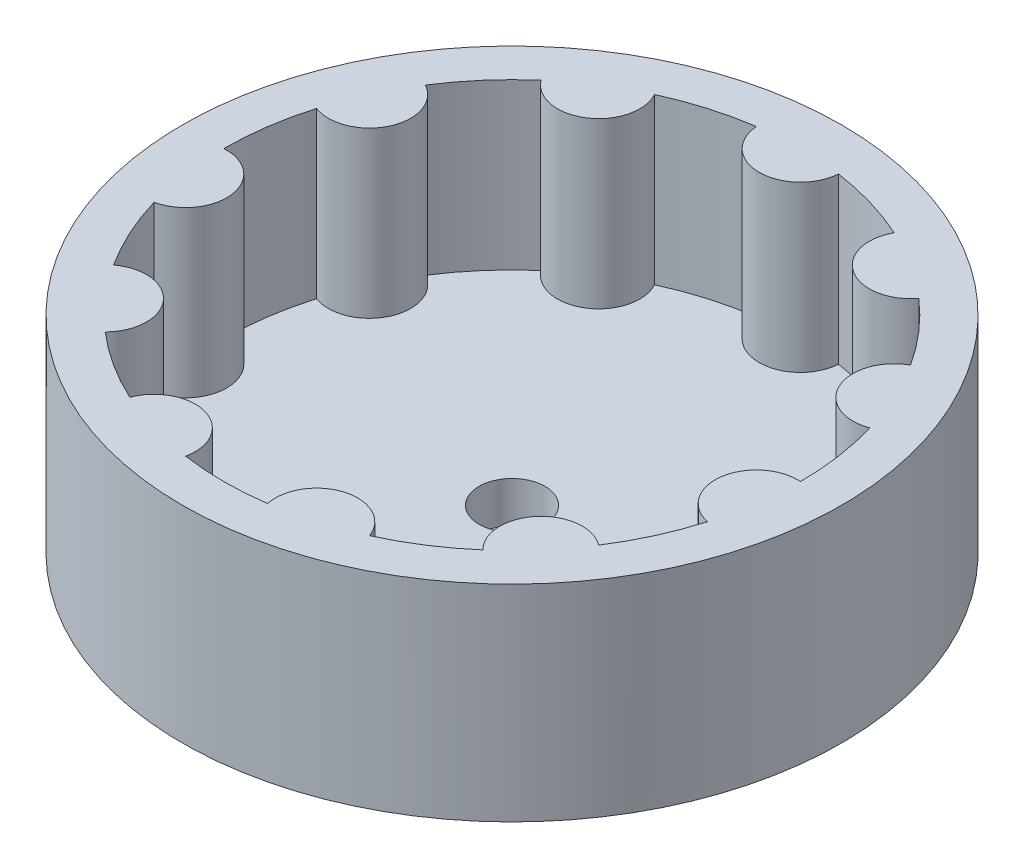
ISO-10303-21;
HEADER;
FILE_DESCRIPTION(('STEP AP214'),'2;1');
FILE_NAME('part.step','',(''),(''),'','','');
FILE_SCHEMA(('AUTOMOTIVE_DESIGN { 1 0 10303 214 1 1 1 1 }'));
ENDSEC;
DATA;
#1=APPLICATION_CONTEXT('core data for automotive mechanical design processes');
#2=APPLICATION_PROTOCOL_DEFINITION('international standard','automotive_design',2000,#1);
#3=PRODUCT_CONTEXT('',#1,'mechanical');
#4=PRODUCT('Part','Part','',(#3));
#5=PRODUCT_RELATED_PRODUCT_CATEGORY('part','',(#4));
#6=PRODUCT_DEFINITION_FORMATION('','',#4);
#7=PRODUCT_DEFINITION_CONTEXT('part definition',#1,'design');
#8=PRODUCT_DEFINITION('design','',#6,#7);
#9=PRODUCT_DEFINITION_SHAPE('','',#8);
#10=(LENGTH_UNIT() NAMED_UNIT(*) SI_UNIT(.MILLI.,.METRE.));
#11=(NAMED_UNIT(*) PLANE_ANGLE_UNIT() SI_UNIT($,.RADIAN.));
#12=(NAMED_UNIT(*) SI_UNIT($,.STERADIAN.) SOLID_ANGLE_UNIT());
#13=UNCERTAINTY_MEASURE_WITH_UNIT(LENGTH_MEASURE(1.E-05),#10,'distance_accuracy_value','');
#14=(GEOMETRIC_REPRESENTATION_CONTEXT(3) GLOBAL_UNCERTAINTY_ASSIGNED_CONTEXT((#13)) GLOBAL_UNIT_ASSIGNED_CONTEXT((#10,
#11,#12)) REPRESENTATION_CONTEXT('',''));
#15=CARTESIAN_POINT('',(0.,0.,0.));
#16=DIRECTION('',(0.,0.,1.));
#17=DIRECTION('',(1.,0.,0.));
#18=AXIS2_PLACEMENT_3D('',#15,#16,#17);
#19=CARTESIAN_POINT('',(0.,0.,0.));
#20=DIRECTION('',(0.,1.,0.));
#21=DIRECTION('',(0.,0.,1.));
#22=AXIS2_PLACEMENT_3D('',#19,#20,#21);
#23=PLANE('',#22);
#24=CARTESIAN_POINT('',(0.,0.,0.));
#25=DIRECTION('',(0.,1.,0.));
#26=DIRECTION('',(0.,0.,1.));
#27=AXIS2_PLACEMENT_3D('',#24,#25,#26);
#28=CIRCLE('',#27,4.);
#29=CARTESIAN_POINT('',(0.,0.,4.));
#30=VERTEX_POINT('',#29);
#31=EDGE_CURVE('E261',#30,#30,#28,.T.);
#32=ORIENTED_EDGE('',*,*,#31,.F.);
#33=EDGE_LOOP('',(#32));
#34=FACE_BOUND('',#33,.T.);
#35=CARTESIAN_POINT('',(0.,0.,0.));
#36=DIRECTION('',(0.,1.,0.));
#37=DIRECTION('',(0.,0.,1.));
#38=AXIS2_PLACEMENT_3D('',#35,#36,#37);
#39=CIRCLE('',#38,35.0000000000015);
#40=CARTESIAN_POINT('',(-22.9153843672518,0.,26.4553427364156));
#41=VERTEX_POINT('',#40);
#42=CARTESIAN_POINT('',(-14.5452315062388,0.,31.8345133531208));
#43=VERTEX_POINT('',#42);
#44=EDGE_CURVE('E216',#41,#43,#39,.T.);
#45=ORIENTED_EDGE('',*,*,#44,.T.);
#46=CARTESIAN_POINT('',(-9.86063948944448,0.,33.5822540765082));
#47=DIRECTION('',(0.,1.,0.));
#48=DIRECTION('',(0.,0.,1.));
#49=AXIS2_PLACEMENT_3D('',#46,#47,#48);
#50=CIRCLE('',#49,5.);
#51=CARTESIAN_POINT('',(-4.97480993205055,0.,34.6446426758897));
#52=VERTEX_POINT('',#51);
#53=EDGE_CURVE('E214',#52,#43,#50,.T.);
#54=ORIENTED_EDGE('',*,*,#53,.F.);
#55=CARTESIAN_POINT('',(4.97480993206165,0.,34.6446426758881));
#56=VERTEX_POINT('',#55);
#57=EDGE_CURVE('E198',#52,#56,#39,.T.);
#58=ORIENTED_EDGE('',*,*,#57,.T.);
#59=CARTESIAN_POINT('',(9.86063948945559,0.,33.5822540765066));
#60=DIRECTION('',(0.,1.,0.));
#61=DIRECTION('',(0.,0.,1.));
#62=AXIS2_PLACEMENT_3D('',#59,#60,#61);
#63=CIRCLE('',#62,5.);
#64=CARTESIAN_POINT('',(14.5452315062488,0.,31.8345133531162));
#65=VERTEX_POINT('',#64);
#66=EDGE_CURVE('E212',#65,#56,#63,.T.);
#67=ORIENTED_EDGE('',*,*,#66,.F.);
#68=CARTESIAN_POINT('',(22.9153843672592,0.,26.4553427364092));
#69=VERTEX_POINT('',#68);
#70=EDGE_CURVE('E218',#65,#69,#39,.T.);
#71=ORIENTED_EDGE('',*,*,#70,.T.);
#72=CARTESIAN_POINT('',(26.4512351024037,0.,22.9201256880828));
#73=DIRECTION('',(0.,1.,0.));
#74=DIRECTION('',(0.,0.,1.));
#75=AXIS2_PLACEMENT_3D('',#72,#73,#74);
#76=CIRCLE('',#75,5.);
#77=CARTESIAN_POINT('',(29.4472647130086,0.,18.917150972652));
#78=VERTEX_POINT('',#77);
#79=EDGE_CURVE('E227',#78,#69,#76,.T.);
#80=ORIENTED_EDGE('',*,*,#79,.F.);
#81=CARTESIAN_POINT('',(33.5804861782211,0.,9.86665840264113));
#82=VERTEX_POINT('',#81);
#83=EDGE_CURVE('E550',#78,#82,#39,.T.);
#84=ORIENTED_EDGE('',*,*,#83,.T.);
#85=CARTESIAN_POINT('',(34.6437504658359,0.,4.98101933956217));
#86=DIRECTION('',(0.,1.,0.));
#87=DIRECTION('',(0.,0.,1.));
#88=AXIS2_PLACEMENT_3D('',#85,#86,#87);
#89=CIRCLE('',#88,5.);
#90=CARTESIAN_POINT('',(34.999999437819,0.,-0.0062731794265589));
#91=VERTEX_POINT('',#90);
#92=EDGE_CURVE('E237',#91,#82,#89,.T.);
#93=ORIENTED_EDGE('',*,*,#92,.F.);
#94=CARTESIAN_POINT('',(33.5840208959766,0.,-9.85462025948801));
#95=VERTEX_POINT('',#94);
#96=EDGE_CURVE('E547',#91,#95,#39,.T.);
#97=ORIENTED_EDGE('',*,*,#96,.T.);
#98=CARTESIAN_POINT('',(31.8371198374098,0.,-14.5395254550686));
#99=DIRECTION('',(0.,1.,0.));
#100=DIRECTION('',(0.,0.,1.));
#101=AXIS2_PLACEMENT_3D('',#98,#99,#100);
#102=CIRCLE('',#101,5.);
#103=CARTESIAN_POINT('',(29.4404816393022,0.,-18.9277056413613));
#104=VERTEX_POINT('',#103);
#105=EDGE_CURVE('E245',#104,#95,#102,.T.);
#106=ORIENTED_EDGE('',*,*,#105,.F.);
#107=CARTESIAN_POINT('',(22.9248662726135,0.,-26.4471266186499));
#108=VERTEX_POINT('',#107);
#109=EDGE_CURVE('E369',#104,#108,#39,.T.);
#110=ORIENTED_EDGE('',*,*,#109,.T.);
#111=CARTESIAN_POINT('',(18.9224286109464,0.,-29.4438736490929));
#112=DIRECTION('',(0.,1.,0.));
#113=DIRECTION('',(0.,0.,1.));
#114=AXIS2_PLACEMENT_3D('',#111,#112,#113);
#115=CIRCLE('',#114,5.);
#116=CARTESIAN_POINT('',(14.5338189368111,0.,-31.8397252989422));
#117=VERTEX_POINT('',#116);
#118=EDGE_CURVE('E253',#117,#108,#115,.T.);
#119=ORIENTED_EDGE('',*,*,#118,.F.);
#120=CARTESIAN_POINT('',(4.98722858706045,0.,-34.6428571428587));
#121=VERTEX_POINT('',#120);
#122=EDGE_CURVE('E354',#117,#121,#39,.T.);
#123=ORIENTED_EDGE('',*,*,#122,.T.);
#124=CARTESIAN_POINT('',(0.,0.,-35.));
#125=DIRECTION('',(0.,1.,0.));
#126=DIRECTION('',(0.,0.,1.));
#127=AXIS2_PLACEMENT_3D('',#124,#125,#126);
#128=CIRCLE('',#127,5.);
#129=CARTESIAN_POINT('',(-4.98722858706045,0.,-34.6428571428587));
#130=VERTEX_POINT('',#129);
#131=EDGE_CURVE('E51',#130,#121,#128,.T.);
#132=ORIENTED_EDGE('',*,*,#131,.F.);
#133=CARTESIAN_POINT('',(-14.5338189368116,0.,-31.8397252989419));
#134=VERTEX_POINT('',#133);
#135=EDGE_CURVE('E370',#130,#134,#39,.T.);
#136=ORIENTED_EDGE('',*,*,#135,.T.);
#137=CARTESIAN_POINT('',(-18.9224286109455,0.,-29.4438736490898));
#138=DIRECTION('',(0.,1.,0.));
#139=DIRECTION('',(0.,0.,1.));
#140=AXIS2_PLACEMENT_3D('',#137,#138,#139);
#141=CIRCLE('',#140,5.);
#142=CARTESIAN_POINT('',(-22.9248662726143,0.,-26.4471266186491));
#143=VERTEX_POINT('',#142);
#144=EDGE_CURVE('E378',#143,#134,#141,.T.);
#145=ORIENTED_EDGE('',*,*,#144,.F.);
#146=CARTESIAN_POINT('',(-29.4404816393038,0.,-18.9277056413588));
#147=VERTEX_POINT('',#146);
#148=EDGE_CURVE('E512',#143,#147,#39,.T.);
#149=ORIENTED_EDGE('',*,*,#148,.T.);
#150=CARTESIAN_POINT('',(-31.8371198374065,0.,-14.5395254550634));
#151=DIRECTION('',(0.,1.,0.));
#152=DIRECTION('',(0.,0.,1.));
#153=AXIS2_PLACEMENT_3D('',#150,#151,#152);
#154=CIRCLE('',#153,5.);
#155=CARTESIAN_POINT('',(-33.5840208959777,0.,-9.85462025948447));
#156=VERTEX_POINT('',#155);
#157=EDGE_CURVE('E386',#156,#147,#154,.T.);
#158=ORIENTED_EDGE('',*,*,#157,.F.);
#159=CARTESIAN_POINT('',(-34.999999437819,0.,-0.0062731794204891));
#160=VERTEX_POINT('',#159);
#161=EDGE_CURVE('E509',#156,#160,#39,.T.);
#162=ORIENTED_EDGE('',*,*,#161,.T.);
#163=CARTESIAN_POINT('',(-34.6437504658294,0.,4.98101933956779));
#164=DIRECTION('',(0.,1.,0.));
#165=DIRECTION('',(0.,0.,1.));
#166=AXIS2_PLACEMENT_3D('',#163,#164,#165);
#167=CIRCLE('',#166,5.);
#168=CARTESIAN_POINT('',(-33.5804861782192,0.,9.86665840264773));
#169=VERTEX_POINT('',#168);
#170=EDGE_CURVE('E394',#169,#160,#167,.T.);
#171=ORIENTED_EDGE('',*,*,#170,.F.);
#172=CARTESIAN_POINT('',(-29.4472647130037,0.,18.9171509726596));
#173=VERTEX_POINT('',#172);
#174=EDGE_CURVE('E505',#169,#173,#39,.T.);
#175=ORIENTED_EDGE('',*,*,#174,.T.);
#176=CARTESIAN_POINT('',(-26.4512351023944,0.,22.9201256880871));
#177=DIRECTION('',(0.,1.,0.));
#178=DIRECTION('',(0.,0.,1.));
#179=AXIS2_PLACEMENT_3D('',#176,#177,#178);
#180=CIRCLE('',#179,5.);
#181=EDGE_CURVE('E402',#41,#173,#180,.T.);
#182=ORIENTED_EDGE('',*,*,#181,.F.);
#183=EDGE_LOOP('',(#45,#54,#58,#67,#71,#80,#84,#93,#97,#106,#110,#119,#123,#132,#136,#145,#149,
#158,#162,#171,#175,#182));
#184=FACE_BOUND('',#183,.T.);
#185=ADVANCED_FACE('F47',(#34,#184),#23,.T.);
#186=CARTESIAN_POINT('',(0.,20.,-35.));
#187=DIRECTION('',(0.,-1.,0.));
#188=DIRECTION('',(0.,0.,-1.));
#189=AXIS2_PLACEMENT_3D('',#186,#187,#188);
#190=CYLINDRICAL_SURFACE('',#189,5.);
#191=CARTESIAN_POINT('',(0.,20.,-35.));
#192=DIRECTION('',(0.,1.,0.));
#193=DIRECTION('',(0.,0.,1.));
#194=AXIS2_PLACEMENT_3D('',#191,#192,#193);
#195=CIRCLE('',#194,5.);
#196=CARTESIAN_POINT('',(-4.98722858706045,20.,-34.6428571428587));
#197=VERTEX_POINT('',#196);
#198=CARTESIAN_POINT('',(4.98722858706045,20.,-34.6428571428587));
#199=VERTEX_POINT('',#198);
#200=EDGE_CURVE('E11',#197,#199,#195,.T.);
#201=ORIENTED_EDGE('',*,*,#200,.F.);
#202=DIRECTION('',(0.,-1.,0.));
#203=VECTOR('',#202,1.);
#204=CARTESIAN_POINT('',(-4.98722858706045,10.,-34.6428571428587));
#205=LINE('',#204,#203);
#206=EDGE_CURVE('E361',#197,#130,#205,.T.);
#207=ORIENTED_EDGE('',*,*,#206,.T.);
#208=ORIENTED_EDGE('',*,*,#131,.T.);
#209=DIRECTION('',(0.,-1.,0.));
#210=VECTOR('',#209,1.);
#211=CARTESIAN_POINT('',(4.98722858706045,10.,-34.6428571428587));
#212=LINE('',#211,#210);
#213=EDGE_CURVE('E352',#121,#199,#212,.F.);
#214=ORIENTED_EDGE('',*,*,#213,.T.);
#215=EDGE_LOOP('',(#201,#207,#208,#214));
#216=FACE_BOUND('',#215,.T.);
#217=ADVANCED_FACE('F49',(#216),#190,.T.);
#218=CARTESIAN_POINT('',(0.,-5.,0.));
#219=DIRECTION('',(0.,1.,0.));
#220=DIRECTION('',(0.,0.,1.));
#221=AXIS2_PLACEMENT_3D('',#218,#219,#220);
#222=PLANE('',#221);
#223=CARTESIAN_POINT('',(0.,-5.,0.));
#224=DIRECTION('',(0.,1.,0.));
#225=DIRECTION('',(0.,0.,1.));
#226=AXIS2_PLACEMENT_3D('',#223,#224,#225);
#227=CIRCLE('',#226,4.);
#228=CARTESIAN_POINT('',(0.,-5.,4.));
#229=VERTEX_POINT('',#228);
#230=EDGE_CURVE('E265',#229,#229,#227,.T.);
#231=ORIENTED_EDGE('',*,*,#230,.T.);
#232=EDGE_LOOP('',(#231));
#233=FACE_BOUND('',#232,.T.);
#234=CARTESIAN_POINT('',(0.,-5.,0.));
#235=DIRECTION('',(0.,-1.,0.));
#236=DIRECTION('',(0.,0.,-1.));
#237=AXIS2_PLACEMENT_3D('',#234,#235,#236);
#238=CIRCLE('',#237,40.0000000000021);
#239=CARTESIAN_POINT('',(0.,-5.,-40.0000000000021));
#240=VERTEX_POINT('',#239);
#241=EDGE_CURVE('E374',#240,#240,#238,.T.);
#242=ORIENTED_EDGE('',*,*,#241,.T.);
#243=EDGE_LOOP('',(#242));
#244=FACE_BOUND('',#243,.T.);
#245=ADVANCED_FACE('F279',(#233,#244),#222,.F.);
#246=CARTESIAN_POINT('',(0.,-5.,0.));
#247=DIRECTION('',(0.,1.,0.));
#248=DIRECTION('',(0.,0.,1.));
#249=AXIS2_PLACEMENT_3D('',#246,#247,#248);
#250=CYLINDRICAL_SURFACE('',#249,4.);
#251=ORIENTED_EDGE('',*,*,#230,.F.);
#252=EDGE_LOOP('',(#251));
#253=FACE_BOUND('',#252,.T.);
#254=ORIENTED_EDGE('',*,*,#31,.T.);
#255=EDGE_LOOP('',(#254));
#256=FACE_BOUND('',#255,.T.);
#257=ADVANCED_FACE('F273',(#253,#256),#250,.F.);
#258=CARTESIAN_POINT('',(18.9224286109464,20.,-29.4438736490929));
#259=DIRECTION('',(0.,-1.,0.));
#260=DIRECTION('',(0.,0.,-1.));
#261=AXIS2_PLACEMENT_3D('',#258,#259,#260);
#262=CYLINDRICAL_SURFACE('',#261,5.);
#263=CARTESIAN_POINT('',(18.9224286109464,20.,-29.4438736490929));
#264=DIRECTION('',(0.,1.,0.));
#265=DIRECTION('',(0.,0.,1.));
#266=AXIS2_PLACEMENT_3D('',#263,#264,#265);
#267=CIRCLE('',#266,5.);
#268=CARTESIAN_POINT('',(14.5338189368111,20.,-31.8397252989422));
#269=VERTEX_POINT('',#268);
#270=CARTESIAN_POINT('',(22.9248662726135,20.,-26.4471266186499));
#271=VERTEX_POINT('',#270);
#272=EDGE_CURVE('E257',#269,#271,#267,.T.);
#273=ORIENTED_EDGE('',*,*,#272,.F.);
#274=DIRECTION('',(0.,-1.,0.));
#275=VECTOR('',#274,1.);
#276=CARTESIAN_POINT('',(14.5338189368111,10.,-31.8397252989422));
#277=LINE('',#276,#275);
#278=EDGE_CURVE('E362',#269,#117,#277,.T.);
#279=ORIENTED_EDGE('',*,*,#278,.T.);
#280=ORIENTED_EDGE('',*,*,#118,.T.);
#281=DIRECTION('',(0.,-1.,0.));
#282=VECTOR('',#281,1.);
#283=CARTESIAN_POINT('',(22.9248662726135,10.,-26.4471266186499));
#284=LINE('',#283,#282);
#285=EDGE_CURVE('E449',#108,#271,#284,.F.);
#286=ORIENTED_EDGE('',*,*,#285,.T.);
#287=EDGE_LOOP('',(#273,#279,#280,#286));
#288=FACE_BOUND('',#287,.T.);
#289=ADVANCED_FACE('F287',(#288),#262,.T.);
#290=CARTESIAN_POINT('',(0.,20.,0.));
#291=DIRECTION('',(0.,1.,0.));
#292=DIRECTION('',(0.,0.,1.));
#293=AXIS2_PLACEMENT_3D('',#290,#291,#292);
#294=PLANE('',#293);
#295=CARTESIAN_POINT('',(0.,20.,0.));
#296=DIRECTION('',(0.,1.,0.));
#297=DIRECTION('',(0.,0.,1.));
#298=AXIS2_PLACEMENT_3D('',#295,#296,#297);
#299=CIRCLE('',#298,40.0000000000021);
#300=CARTESIAN_POINT('',(0.,20.,40.0000000000021));
#301=VERTEX_POINT('',#300);
#302=EDGE_CURVE('E467',#301,#301,#299,.T.);
#303=ORIENTED_EDGE('',*,*,#302,.T.);
#304=EDGE_LOOP('',(#303));
#305=FACE_BOUND('',#304,.T.);
#306=ORIENTED_EDGE('',*,*,#272,.T.);
#307=CARTESIAN_POINT('',(0.,20.,0.));
#308=DIRECTION('',(0.,1.,0.));
#309=DIRECTION('',(0.,0.,1.));
#310=AXIS2_PLACEMENT_3D('',#307,#308,#309);
#311=CIRCLE('',#310,35.0000000000015);
#312=CARTESIAN_POINT('',(29.4404816393022,20.,-18.9277056413613));
#313=VERTEX_POINT('',#312);
#314=EDGE_CURVE('E457',#313,#271,#311,.T.);
#315=ORIENTED_EDGE('',*,*,#314,.F.);
#316=CARTESIAN_POINT('',(31.8371198374098,20.,-14.5395254550686));
#317=DIRECTION('',(0.,1.,0.));
#318=DIRECTION('',(0.,0.,1.));
#319=AXIS2_PLACEMENT_3D('',#316,#317,#318);
#320=CIRCLE('',#319,5.);
#321=CARTESIAN_POINT('',(33.5840208959766,20.,-9.85462025948801));
#322=VERTEX_POINT('',#321);
#323=EDGE_CURVE('E249',#313,#322,#320,.T.);
#324=ORIENTED_EDGE('',*,*,#323,.T.);
#325=CARTESIAN_POINT('',(34.999999437819,20.,-0.00627317942655803));
#326=VERTEX_POINT('',#325);
#327=EDGE_CURVE('E461',#326,#322,#311,.T.);
#328=ORIENTED_EDGE('',*,*,#327,.F.);
#329=CARTESIAN_POINT('',(34.6437504658359,20.,4.98101933956217));
#330=DIRECTION('',(0.,1.,0.));
#331=DIRECTION('',(0.,0.,1.));
#332=AXIS2_PLACEMENT_3D('',#329,#330,#331);
#333=CIRCLE('',#332,5.);
#334=CARTESIAN_POINT('',(33.5804861782211,20.,9.86665840264113));
#335=VERTEX_POINT('',#334);
#336=EDGE_CURVE('E241',#326,#335,#333,.T.);
#337=ORIENTED_EDGE('',*,*,#336,.T.);
#338=CARTESIAN_POINT('',(29.4472647130086,20.,18.917150972652));
#339=VERTEX_POINT('',#338);
#340=EDGE_CURVE('E536',#339,#335,#311,.T.);
#341=ORIENTED_EDGE('',*,*,#340,.F.);
#342=CARTESIAN_POINT('',(26.4512351024037,20.,22.9201256880828));
#343=DIRECTION('',(0.,1.,0.));
#344=DIRECTION('',(0.,0.,1.));
#345=AXIS2_PLACEMENT_3D('',#342,#343,#344);
#346=CIRCLE('',#345,5.);
#347=CARTESIAN_POINT('',(22.9153843672592,20.,26.4553427364092));
#348=VERTEX_POINT('',#347);
#349=EDGE_CURVE('E233',#339,#348,#346,.T.);
#350=ORIENTED_EDGE('',*,*,#349,.T.);
#351=CARTESIAN_POINT('',(14.5452315062488,20.,31.8345133531162));
#352=VERTEX_POINT('',#351);
#353=EDGE_CURVE('E465',#352,#348,#311,.T.);
#354=ORIENTED_EDGE('',*,*,#353,.F.);
#355=CARTESIAN_POINT('',(9.86063948945559,20.,33.5822540765066));
#356=DIRECTION('',(0.,1.,0.));
#357=DIRECTION('',(0.,0.,1.));
#358=AXIS2_PLACEMENT_3D('',#355,#356,#357);
#359=CIRCLE('',#358,5.);
#360=CARTESIAN_POINT('',(4.97480993206165,20.,34.6446426758881));
#361=VERTEX_POINT('',#360);
#362=EDGE_CURVE('E222',#352,#361,#359,.T.);
#363=ORIENTED_EDGE('',*,*,#362,.T.);
#364=CARTESIAN_POINT('',(-4.97480993205055,20.,34.6446426758897));
#365=VERTEX_POINT('',#364);
#366=EDGE_CURVE('E199',#365,#361,#311,.T.);
#367=ORIENTED_EDGE('',*,*,#366,.F.);
#368=CARTESIAN_POINT('',(-9.86063948944448,20.,33.5822540765082));
#369=DIRECTION('',(0.,1.,0.));
#370=DIRECTION('',(0.,0.,1.));
#371=AXIS2_PLACEMENT_3D('',#368,#369,#370);
#372=CIRCLE('',#371,5.);
#373=CARTESIAN_POINT('',(-14.5452315062388,20.,31.8345133531208));
#374=VERTEX_POINT('',#373);
#375=EDGE_CURVE('E223',#365,#374,#372,.T.);
#376=ORIENTED_EDGE('',*,*,#375,.T.);
#377=CARTESIAN_POINT('',(-22.9153843672518,20.,26.4553427364156));
#378=VERTEX_POINT('',#377);
#379=EDGE_CURVE('E464',#378,#374,#311,.T.);
#380=ORIENTED_EDGE('',*,*,#379,.F.);
#381=CARTESIAN_POINT('',(-26.4512351023944,20.,22.9201256880871));
#382=DIRECTION('',(0.,1.,0.));
#383=DIRECTION('',(0.,0.,1.));
#384=AXIS2_PLACEMENT_3D('',#381,#382,#383);
#385=CIRCLE('',#384,5.);
#386=CARTESIAN_POINT('',(-29.4472647130037,20.,18.9171509726596));
#387=VERTEX_POINT('',#386);
#388=EDGE_CURVE('E406',#378,#387,#385,.T.);
#389=ORIENTED_EDGE('',*,*,#388,.T.);
#390=CARTESIAN_POINT('',(-33.5804861782192,20.,9.86665840264773));
#391=VERTEX_POINT('',#390);
#392=EDGE_CURVE('E525',#391,#387,#311,.T.);
#393=ORIENTED_EDGE('',*,*,#392,.F.);
#394=CARTESIAN_POINT('',(-34.6437504658294,20.,4.98101933956779));
#395=DIRECTION('',(0.,1.,0.));
#396=DIRECTION('',(0.,0.,1.));
#397=AXIS2_PLACEMENT_3D('',#394,#395,#396);
#398=CIRCLE('',#397,5.);
#399=CARTESIAN_POINT('',(-34.999999437819,20.,-0.0062731794204891));
#400=VERTEX_POINT('',#399);
#401=EDGE_CURVE('E398',#391,#400,#398,.T.);
#402=ORIENTED_EDGE('',*,*,#401,.T.);
#403=CARTESIAN_POINT('',(-33.5840208959777,20.,-9.85462025948446));
#404=VERTEX_POINT('',#403);
#405=EDGE_CURVE('E523',#404,#400,#311,.T.);
#406=ORIENTED_EDGE('',*,*,#405,.F.);
#407=CARTESIAN_POINT('',(-31.8371198374065,20.,-14.5395254550634));
#408=DIRECTION('',(0.,1.,0.));
#409=DIRECTION('',(0.,0.,1.));
#410=AXIS2_PLACEMENT_3D('',#407,#408,#409);
#411=CIRCLE('',#410,5.);
#412=CARTESIAN_POINT('',(-29.4404816393038,20.,-18.9277056413588));
#413=VERTEX_POINT('',#412);
#414=EDGE_CURVE('E390',#404,#413,#411,.T.);
#415=ORIENTED_EDGE('',*,*,#414,.T.);
#416=CARTESIAN_POINT('',(-22.9248662726143,20.,-26.4471266186491));
#417=VERTEX_POINT('',#416);
#418=EDGE_CURVE('E462',#417,#413,#311,.T.);
#419=ORIENTED_EDGE('',*,*,#418,.F.);
#420=CARTESIAN_POINT('',(-18.9224286109455,20.,-29.4438736490898));
#421=DIRECTION('',(0.,1.,0.));
#422=DIRECTION('',(0.,0.,1.));
#423=AXIS2_PLACEMENT_3D('',#420,#421,#422);
#424=CIRCLE('',#423,5.);
#425=CARTESIAN_POINT('',(-14.5338189368116,20.,-31.8397252989419));
#426=VERTEX_POINT('',#425);
#427=EDGE_CURVE('E382',#417,#426,#424,.T.);
#428=ORIENTED_EDGE('',*,*,#427,.T.);
#429=EDGE_CURVE('E63',#197,#426,#311,.T.);
#430=ORIENTED_EDGE('',*,*,#429,.F.);
#431=ORIENTED_EDGE('',*,*,#200,.T.);
#432=EDGE_CURVE('E357',#269,#199,#311,.T.);
#433=ORIENTED_EDGE('',*,*,#432,.F.);
#434=EDGE_LOOP('',(#306,#315,#324,#328,#337,#341,#350,#354,#363,#367,#376,#380,#389,#393,#402,
#406,#415,#419,#428,#430,#431,#433));
#435=FACE_BOUND('',#434,.T.);
#436=ADVANCED_FACE('F291',(#305,#435),#294,.T.);
#437=CARTESIAN_POINT('',(31.8371198374098,20.,-14.5395254550686));
#438=DIRECTION('',(0.,-1.,0.));
#439=DIRECTION('',(0.,0.,-1.));
#440=AXIS2_PLACEMENT_3D('',#437,#438,#439);
#441=CYLINDRICAL_SURFACE('',#440,5.);
#442=ORIENTED_EDGE('',*,*,#323,.F.);
#443=DIRECTION('',(0.,-1.,0.));
#444=VECTOR('',#443,1.);
#445=CARTESIAN_POINT('',(29.4404816393022,10.,-18.9277056413613));
#446=LINE('',#445,#444);
#447=EDGE_CURVE('E445',#313,#104,#446,.T.);
#448=ORIENTED_EDGE('',*,*,#447,.T.);
#449=ORIENTED_EDGE('',*,*,#105,.T.);
#450=DIRECTION('',(0.,-1.,0.));
#451=VECTOR('',#450,1.);
#452=CARTESIAN_POINT('',(33.5840208959766,10.,-9.85462025948801));
#453=LINE('',#452,#451);
#454=EDGE_CURVE('E441',#95,#322,#453,.F.);
#455=ORIENTED_EDGE('',*,*,#454,.T.);
#456=EDGE_LOOP('',(#442,#448,#449,#455));
#457=FACE_BOUND('',#456,.T.);
#458=ADVANCED_FACE('F295',(#457),#441,.T.);
#459=CARTESIAN_POINT('',(34.6437504658359,20.,4.98101933956217));
#460=DIRECTION('',(0.,-1.,0.));
#461=DIRECTION('',(0.,0.,-1.));
#462=AXIS2_PLACEMENT_3D('',#459,#460,#461);
#463=CYLINDRICAL_SURFACE('',#462,5.);
#464=ORIENTED_EDGE('',*,*,#336,.F.);
#465=DIRECTION('',(0.,-1.,0.));
#466=VECTOR('',#465,1.);
#467=CARTESIAN_POINT('',(34.999999437819,10.,-0.00627317942655803));
#468=LINE('',#467,#466);
#469=EDGE_CURVE('E437',#326,#91,#468,.T.);
#470=ORIENTED_EDGE('',*,*,#469,.T.);
#471=ORIENTED_EDGE('',*,*,#92,.T.);
#472=DIRECTION('',(0.,-1.,0.));
#473=VECTOR('',#472,1.);
#474=CARTESIAN_POINT('',(33.5804861782211,10.,9.86665840264113));
#475=LINE('',#474,#473);
#476=EDGE_CURVE('E433',#82,#335,#475,.F.);
#477=ORIENTED_EDGE('',*,*,#476,.T.);
#478=EDGE_LOOP('',(#464,#470,#471,#477));
#479=FACE_BOUND('',#478,.T.);
#480=ADVANCED_FACE('F299',(#479),#463,.T.);
#481=CARTESIAN_POINT('',(26.4512351024037,20.,22.9201256880828));
#482=DIRECTION('',(0.,-1.,0.));
#483=DIRECTION('',(0.,0.,-1.));
#484=AXIS2_PLACEMENT_3D('',#481,#482,#483);
#485=CYLINDRICAL_SURFACE('',#484,5.);
#486=ORIENTED_EDGE('',*,*,#349,.F.);
#487=DIRECTION('',(0.,-1.,0.));
#488=VECTOR('',#487,1.);
#489=CARTESIAN_POINT('',(29.4472647130086,10.,18.917150972652));
#490=LINE('',#489,#488);
#491=EDGE_CURVE('E429',#339,#78,#490,.T.);
#492=ORIENTED_EDGE('',*,*,#491,.T.);
#493=ORIENTED_EDGE('',*,*,#79,.T.);
#494=DIRECTION('',(0.,-1.,0.));
#495=VECTOR('',#494,1.);
#496=CARTESIAN_POINT('',(22.9153843672592,10.,26.4553427364092));
#497=LINE('',#496,#495);
#498=EDGE_CURVE('E425',#69,#348,#497,.F.);
#499=ORIENTED_EDGE('',*,*,#498,.T.);
#500=EDGE_LOOP('',(#486,#492,#493,#499));
#501=FACE_BOUND('',#500,.T.);
#502=ADVANCED_FACE('F303',(#501),#485,.T.);
#503=CARTESIAN_POINT('',(9.86063948945559,20.,33.5822540765066));
#504=DIRECTION('',(0.,-1.,0.));
#505=DIRECTION('',(0.,0.,-1.));
#506=AXIS2_PLACEMENT_3D('',#503,#504,#505);
#507=CYLINDRICAL_SURFACE('',#506,5.);
#508=ORIENTED_EDGE('',*,*,#362,.F.);
#509=DIRECTION('',(0.,-1.,0.));
#510=VECTOR('',#509,1.);
#511=CARTESIAN_POINT('',(14.5452315062488,10.,31.8345133531162));
#512=LINE('',#511,#510);
#513=EDGE_CURVE('E205',#352,#65,#512,.T.);
#514=ORIENTED_EDGE('',*,*,#513,.T.);
#515=ORIENTED_EDGE('',*,*,#66,.T.);
#516=DIRECTION('',(0.,-1.,0.));
#517=VECTOR('',#516,1.);
#518=CARTESIAN_POINT('',(4.97480993206165,10.,34.6446426758881));
#519=LINE('',#518,#517);
#520=EDGE_CURVE('E195',#56,#361,#519,.F.);
#521=ORIENTED_EDGE('',*,*,#520,.T.);
#522=EDGE_LOOP('',(#508,#514,#515,#521));
#523=FACE_BOUND('',#522,.T.);
#524=ADVANCED_FACE('F220',(#523),#507,.T.);
#525=CARTESIAN_POINT('',(-9.86063948944448,20.,33.5822540765082));
#526=DIRECTION('',(0.,-1.,0.));
#527=DIRECTION('',(0.,0.,-1.));
#528=AXIS2_PLACEMENT_3D('',#525,#526,#527);
#529=CYLINDRICAL_SURFACE('',#528,5.);
#530=ORIENTED_EDGE('',*,*,#375,.F.);
#531=DIRECTION('',(0.,-1.,0.));
#532=VECTOR('',#531,1.);
#533=CARTESIAN_POINT('',(-4.97480993205055,10.,34.6446426758897));
#534=LINE('',#533,#532);
#535=EDGE_CURVE('E71',#365,#52,#534,.T.);
#536=ORIENTED_EDGE('',*,*,#535,.T.);
#537=ORIENTED_EDGE('',*,*,#53,.T.);
#538=DIRECTION('',(0.,-1.,0.));
#539=VECTOR('',#538,1.);
#540=CARTESIAN_POINT('',(-14.5452315062388,10.,31.8345133531208));
#541=LINE('',#540,#539);
#542=EDGE_CURVE('E415',#43,#374,#541,.F.);
#543=ORIENTED_EDGE('',*,*,#542,.T.);
#544=EDGE_LOOP('',(#530,#536,#537,#543));
#545=FACE_BOUND('',#544,.T.);
#546=ADVANCED_FACE('F310',(#545),#529,.T.);
#547=CARTESIAN_POINT('',(-26.4512351023944,20.,22.9201256880871));
#548=DIRECTION('',(0.,-1.,0.));
#549=DIRECTION('',(0.,0.,-1.));
#550=AXIS2_PLACEMENT_3D('',#547,#548,#549);
#551=CYLINDRICAL_SURFACE('',#550,5.);
#552=ORIENTED_EDGE('',*,*,#388,.F.);
#553=DIRECTION('',(0.,-1.,0.));
#554=VECTOR('',#553,1.);
#555=CARTESIAN_POINT('',(-22.9153843672518,10.,26.4553427364156));
#556=LINE('',#555,#554);
#557=EDGE_CURVE('E419',#378,#41,#556,.T.);
#558=ORIENTED_EDGE('',*,*,#557,.T.);
#559=ORIENTED_EDGE('',*,*,#181,.T.);
#560=DIRECTION('',(0.,-1.,0.));
#561=VECTOR('',#560,1.);
#562=CARTESIAN_POINT('',(-29.4472647130037,10.,18.9171509726596));
#563=LINE('',#562,#561);
#564=EDGE_CURVE('E494',#173,#387,#563,.F.);
#565=ORIENTED_EDGE('',*,*,#564,.T.);
#566=EDGE_LOOP('',(#552,#558,#559,#565));
#567=FACE_BOUND('',#566,.T.);
#568=ADVANCED_FACE('F313',(#567),#551,.T.);
#569=CARTESIAN_POINT('',(-34.6437504658294,20.,4.98101933956779));
#570=DIRECTION('',(0.,-1.,0.));
#571=DIRECTION('',(0.,0.,-1.));
#572=AXIS2_PLACEMENT_3D('',#569,#570,#571);
#573=CYLINDRICAL_SURFACE('',#572,5.);
#574=ORIENTED_EDGE('',*,*,#401,.F.);
#575=DIRECTION('',(0.,-1.,0.));
#576=VECTOR('',#575,1.);
#577=CARTESIAN_POINT('',(-33.5804861782192,10.,9.86665840264773));
#578=LINE('',#577,#576);
#579=EDGE_CURVE('E490',#391,#169,#578,.T.);
#580=ORIENTED_EDGE('',*,*,#579,.T.);
#581=ORIENTED_EDGE('',*,*,#170,.T.);
#582=DIRECTION('',(0.,-1.,0.));
#583=VECTOR('',#582,1.);
#584=CARTESIAN_POINT('',(-34.999999437819,10.,-0.0062731794204891));
#585=LINE('',#584,#583);
#586=EDGE_CURVE('E486',#160,#400,#585,.F.);
#587=ORIENTED_EDGE('',*,*,#586,.T.);
#588=EDGE_LOOP('',(#574,#580,#581,#587));
#589=FACE_BOUND('',#588,.T.);
#590=ADVANCED_FACE('F317',(#589),#573,.T.);
#591=CARTESIAN_POINT('',(-31.8371198374065,20.,-14.5395254550634));
#592=DIRECTION('',(0.,-1.,0.));
#593=DIRECTION('',(0.,0.,-1.));
#594=AXIS2_PLACEMENT_3D('',#591,#592,#593);
#595=CYLINDRICAL_SURFACE('',#594,5.);
#596=ORIENTED_EDGE('',*,*,#414,.F.);
#597=DIRECTION('',(0.,-1.,0.));
#598=VECTOR('',#597,1.);
#599=CARTESIAN_POINT('',(-33.5840208959777,10.,-9.85462025948446));
#600=LINE('',#599,#598);
#601=EDGE_CURVE('E482',#404,#156,#600,.T.);
#602=ORIENTED_EDGE('',*,*,#601,.T.);
#603=ORIENTED_EDGE('',*,*,#157,.T.);
#604=DIRECTION('',(0.,-1.,0.));
#605=VECTOR('',#604,1.);
#606=CARTESIAN_POINT('',(-29.4404816393038,10.,-18.9277056413588));
#607=LINE('',#606,#605);
#608=EDGE_CURVE('E478',#147,#413,#607,.F.);
#609=ORIENTED_EDGE('',*,*,#608,.T.);
#610=EDGE_LOOP('',(#596,#602,#603,#609));
#611=FACE_BOUND('',#610,.T.);
#612=ADVANCED_FACE('F321',(#611),#595,.T.);
#613=CARTESIAN_POINT('',(-18.9224286109455,20.,-29.4438736490898));
#614=DIRECTION('',(0.,-1.,0.));
#615=DIRECTION('',(0.,0.,-1.));
#616=AXIS2_PLACEMENT_3D('',#613,#614,#615);
#617=CYLINDRICAL_SURFACE('',#616,5.);
#618=ORIENTED_EDGE('',*,*,#427,.F.);
#619=DIRECTION('',(0.,-1.,0.));
#620=VECTOR('',#619,1.);
#621=CARTESIAN_POINT('',(-22.9248662726143,10.,-26.4471266186491));
#622=LINE('',#621,#620);
#623=EDGE_CURVE('E474',#417,#143,#622,.T.);
#624=ORIENTED_EDGE('',*,*,#623,.T.);
#625=ORIENTED_EDGE('',*,*,#144,.T.);
#626=DIRECTION('',(0.,-1.,0.));
#627=VECTOR('',#626,1.);
#628=CARTESIAN_POINT('',(-14.5338189368116,10.,-31.8397252989419));
#629=LINE('',#628,#627);
#630=EDGE_CURVE('E471',#134,#426,#629,.F.);
#631=ORIENTED_EDGE('',*,*,#630,.T.);
#632=EDGE_LOOP('',(#618,#624,#625,#631));
#633=FACE_BOUND('',#632,.T.);
#634=ADVANCED_FACE('F325',(#633),#617,.T.);
#635=CARTESIAN_POINT('',(0.,0.,0.));
#636=DIRECTION('',(0.,-1.,0.));
#637=DIRECTION('',(0.,0.,-1.));
#638=AXIS2_PLACEMENT_3D('',#635,#636,#637);
#639=CYLINDRICAL_SURFACE('',#638,40.0000000000021);
#640=ORIENTED_EDGE('',*,*,#302,.F.);
#641=EDGE_LOOP('',(#640));
#642=FACE_BOUND('',#641,.T.);
#643=ORIENTED_EDGE('',*,*,#241,.F.);
#644=EDGE_LOOP('',(#643));
#645=FACE_BOUND('',#644,.T.);
#646=ADVANCED_FACE('F329',(#642,#645),#639,.T.);
#647=CARTESIAN_POINT('',(0.,20.,0.));
#648=DIRECTION('',(0.,-1.,0.));
#649=DIRECTION('',(0.,0.,-1.));
#650=AXIS2_PLACEMENT_3D('',#647,#648,#649);
#651=CYLINDRICAL_SURFACE('',#650,35.0000000000015);
#652=ORIENTED_EDGE('',*,*,#206,.F.);
#653=ORIENTED_EDGE('',*,*,#429,.T.);
#654=ORIENTED_EDGE('',*,*,#630,.F.);
#655=ORIENTED_EDGE('',*,*,#135,.F.);
#656=EDGE_LOOP('',(#652,#653,#654,#655));
#657=FACE_BOUND('',#656,.T.);
#658=ADVANCED_FACE('F333',(#657),#651,.F.);
#659=ORIENTED_EDGE('',*,*,#608,.F.);
#660=ORIENTED_EDGE('',*,*,#148,.F.);
#661=ORIENTED_EDGE('',*,*,#623,.F.);
#662=ORIENTED_EDGE('',*,*,#418,.T.);
#663=EDGE_LOOP('',(#659,#660,#661,#662));
#664=FACE_BOUND('',#663,.T.);
#665=ADVANCED_FACE('F336',(#664),#651,.F.);
#666=ORIENTED_EDGE('',*,*,#586,.F.);
#667=ORIENTED_EDGE('',*,*,#161,.F.);
#668=ORIENTED_EDGE('',*,*,#601,.F.);
#669=ORIENTED_EDGE('',*,*,#405,.T.);
#670=EDGE_LOOP('',(#666,#667,#668,#669));
#671=FACE_BOUND('',#670,.T.);
#672=ADVANCED_FACE('F341',(#671),#651,.F.);
#673=ORIENTED_EDGE('',*,*,#564,.F.);
#674=ORIENTED_EDGE('',*,*,#174,.F.);
#675=ORIENTED_EDGE('',*,*,#579,.F.);
#676=ORIENTED_EDGE('',*,*,#392,.T.);
#677=EDGE_LOOP('',(#673,#674,#675,#676));
#678=FACE_BOUND('',#677,.T.);
#679=ADVANCED_FACE('F568',(#678),#651,.F.);
#680=ORIENTED_EDGE('',*,*,#542,.F.);
#681=ORIENTED_EDGE('',*,*,#44,.F.);
#682=ORIENTED_EDGE('',*,*,#557,.F.);
#683=ORIENTED_EDGE('',*,*,#379,.T.);
#684=EDGE_LOOP('',(#680,#681,#682,#683));
#685=FACE_BOUND('',#684,.T.);
#686=ADVANCED_FACE('F530',(#685),#651,.F.);
#687=ORIENTED_EDGE('',*,*,#520,.F.);
#688=ORIENTED_EDGE('',*,*,#57,.F.);
#689=ORIENTED_EDGE('',*,*,#535,.F.);
#690=ORIENTED_EDGE('',*,*,#366,.T.);
#691=EDGE_LOOP('',(#687,#688,#689,#690));
#692=FACE_BOUND('',#691,.T.);
#693=ADVANCED_FACE('F197',(#692),#651,.F.);
#694=ORIENTED_EDGE('',*,*,#498,.F.);
#695=ORIENTED_EDGE('',*,*,#70,.F.);
#696=ORIENTED_EDGE('',*,*,#513,.F.);
#697=ORIENTED_EDGE('',*,*,#353,.T.);
#698=EDGE_LOOP('',(#694,#695,#696,#697));
#699=FACE_BOUND('',#698,.T.);
#700=ADVANCED_FACE('F557',(#699),#651,.F.);
#701=ORIENTED_EDGE('',*,*,#476,.F.);
#702=ORIENTED_EDGE('',*,*,#83,.F.);
#703=ORIENTED_EDGE('',*,*,#491,.F.);
#704=ORIENTED_EDGE('',*,*,#340,.T.);
#705=EDGE_LOOP('',(#701,#702,#703,#704));
#706=FACE_BOUND('',#705,.T.);
#707=ADVANCED_FACE('F555',(#706),#651,.F.);
#708=ORIENTED_EDGE('',*,*,#454,.F.);
#709=ORIENTED_EDGE('',*,*,#96,.F.);
#710=ORIENTED_EDGE('',*,*,#469,.F.);
#711=ORIENTED_EDGE('',*,*,#327,.T.);
#712=EDGE_LOOP('',(#708,#709,#710,#711));
#713=FACE_BOUND('',#712,.T.);
#714=ADVANCED_FACE('F349',(#713),#651,.F.);
#715=ORIENTED_EDGE('',*,*,#285,.F.);
#716=ORIENTED_EDGE('',*,*,#109,.F.);
#717=ORIENTED_EDGE('',*,*,#447,.F.);
#718=ORIENTED_EDGE('',*,*,#314,.T.);
#719=EDGE_LOOP('',(#715,#716,#717,#718));
#720=FACE_BOUND('',#719,.T.);
#721=ADVANCED_FACE('F344',(#720),#651,.F.);
#722=ORIENTED_EDGE('',*,*,#213,.F.);
#723=ORIENTED_EDGE('',*,*,#122,.F.);
#724=ORIENTED_EDGE('',*,*,#278,.F.);
#725=ORIENTED_EDGE('',*,*,#432,.T.);
#726=EDGE_LOOP('',(#722,#723,#724,#725));
#727=FACE_BOUND('',#726,.T.);
#728=ADVANCED_FACE('F337',(#727),#651,.F.);
#729=CLOSED_SHELL('',(#185,#217,#245,#257,#289,#436,#458,#480,#502,#524,#546,#568,#590,#612,
#634,#646,#658,#665,#672,#679,#686,#693,#700,#707,#714,#721,#728));
#730=MANIFOLD_SOLID_BREP('B2',#729);
#731=ADVANCED_BREP_SHAPE_REPRESENTATION('',(#18,#730),#14);
#732=SHAPE_DEFINITION_REPRESENTATION(#9,#731);
ENDSEC;
END-ISO-10303-21;
